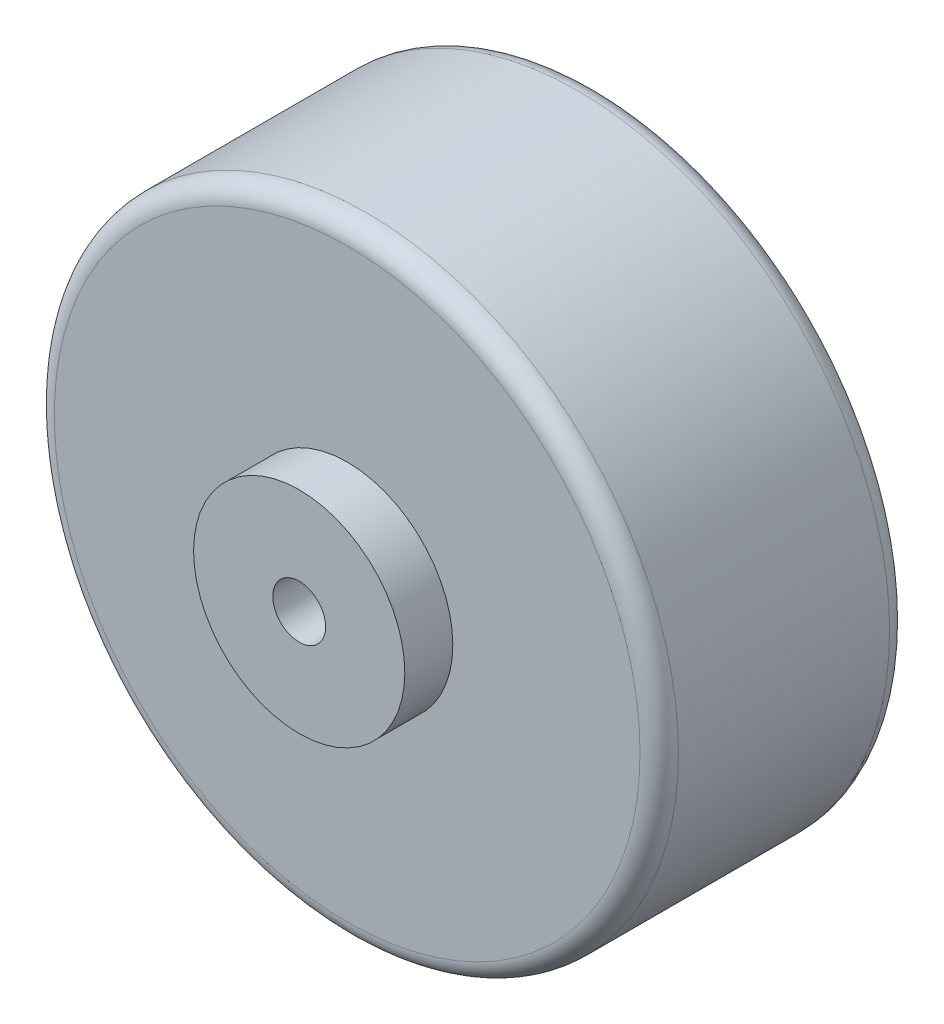
ISO-10303-21;
HEADER;
FILE_DESCRIPTION(('STEP AP214'),'2;1');
FILE_NAME('part.step','',(''),(''),'','','');
FILE_SCHEMA(('AUTOMOTIVE_DESIGN { 1 0 10303 214 1 1 1 1 }'));
ENDSEC;
DATA;
#1=APPLICATION_CONTEXT('core data for automotive mechanical design processes');
#2=APPLICATION_PROTOCOL_DEFINITION('international standard','automotive_design',2000,#1);
#3=PRODUCT_CONTEXT('',#1,'mechanical');
#4=PRODUCT('Part','Part','',(#3));
#5=PRODUCT_RELATED_PRODUCT_CATEGORY('part','',(#4));
#6=PRODUCT_DEFINITION_FORMATION('','',#4);
#7=PRODUCT_DEFINITION_CONTEXT('part definition',#1,'design');
#8=PRODUCT_DEFINITION('design','',#6,#7);
#9=PRODUCT_DEFINITION_SHAPE('','',#8);
#10=(LENGTH_UNIT() NAMED_UNIT(*) SI_UNIT(.MILLI.,.METRE.));
#11=(NAMED_UNIT(*) PLANE_ANGLE_UNIT() SI_UNIT($,.RADIAN.));
#12=(NAMED_UNIT(*) SI_UNIT($,.STERADIAN.) SOLID_ANGLE_UNIT());
#13=UNCERTAINTY_MEASURE_WITH_UNIT(LENGTH_MEASURE(1.E-05),#10,'distance_accuracy_value','');
#14=(GEOMETRIC_REPRESENTATION_CONTEXT(3) GLOBAL_UNCERTAINTY_ASSIGNED_CONTEXT((#13)) GLOBAL_UNIT_ASSIGNED_CONTEXT((#10,
#11,#12)) REPRESENTATION_CONTEXT('',''));
#15=CARTESIAN_POINT('',(0.,0.,0.));
#16=DIRECTION('',(0.,0.,1.));
#17=DIRECTION('',(1.,0.,0.));
#18=AXIS2_PLACEMENT_3D('',#15,#16,#17);
#19=CARTESIAN_POINT('',(0.,0.,26.));
#20=DIRECTION('',(0.,0.,1.));
#21=DIRECTION('',(1.,0.,0.));
#22=AXIS2_PLACEMENT_3D('',#19,#20,#21);
#23=PLANE('',#22);
#24=CARTESIAN_POINT('',(0.,0.,26.));
#25=DIRECTION('',(0.,0.,1.));
#26=DIRECTION('',(1.,0.,0.));
#27=AXIS2_PLACEMENT_3D('',#24,#25,#26);
#28=CIRCLE('',#27,30.5);
#29=CARTESIAN_POINT('',(30.5,0.,26.));
#30=VERTEX_POINT('',#29);
#31=EDGE_CURVE('E10',#30,#30,#28,.T.);
#32=ORIENTED_EDGE('',*,*,#31,.T.);
#33=EDGE_LOOP('',(#32));
#34=FACE_BOUND('',#33,.T.);
#35=CARTESIAN_POINT('',(0.,0.,26.));
#36=DIRECTION('',(0.,0.,1.));
#37=DIRECTION('',(1.,0.,0.));
#38=AXIS2_PLACEMENT_3D('',#35,#36,#37);
#39=CIRCLE('',#38,11.);
#40=CARTESIAN_POINT('',(11.,0.,26.));
#41=VERTEX_POINT('',#40);
#42=EDGE_CURVE('E53',#41,#41,#39,.T.);
#43=ORIENTED_EDGE('',*,*,#42,.F.);
#44=EDGE_LOOP('',(#43));
#45=FACE_BOUND('',#44,.T.);
#46=ADVANCED_FACE('F32',(#34,#45),#23,.T.);
#47=CARTESIAN_POINT('',(0.,0.,26.));
#48=DIRECTION('',(0.,0.,-1.));
#49=DIRECTION('',(-1.,0.,0.));
#50=AXIS2_PLACEMENT_3D('',#47,#48,#49);
#51=CYLINDRICAL_SURFACE('',#50,32.5);
#52=CARTESIAN_POINT('',(0.,0.,2.));
#53=DIRECTION('',(0.,0.,1.));
#54=DIRECTION('',(1.,0.,0.));
#55=AXIS2_PLACEMENT_3D('',#52,#53,#54);
#56=CIRCLE('',#55,32.5);
#57=CARTESIAN_POINT('',(-32.5,0.,1.99999999999999));
#58=VERTEX_POINT('',#57);
#59=EDGE_CURVE('E43',#58,#58,#56,.T.);
#60=CARTESIAN_POINT('',(0.,0.,24.));
#61=DIRECTION('',(0.,0.,1.));
#62=DIRECTION('',(1.,0.,0.));
#63=AXIS2_PLACEMENT_3D('',#60,#61,#62);
#64=CIRCLE('',#63,32.5);
#65=CARTESIAN_POINT('',(-32.5,0.,24.));
#66=VERTEX_POINT('',#65);
#67=EDGE_CURVE('E47',#66,#66,#64,.F.);
#68=CARTESIAN_POINT('',(-32.5,0.,1.99999999999999));
#69=CARTESIAN_POINT('',(-32.5,0.,2.22916666666666));
#70=CARTESIAN_POINT('',(-32.5,0.,2.45833333333333));
#71=CARTESIAN_POINT('',(-32.5,0.,2.91666666666666));
#72=CARTESIAN_POINT('',(-32.5,0.,3.14583333333333));
#73=CARTESIAN_POINT('',(-32.5,0.,3.60416666666666));
#74=CARTESIAN_POINT('',(-32.5,0.,3.83333333333333));
#75=CARTESIAN_POINT('',(-32.5,0.,4.29166666666666));
#76=CARTESIAN_POINT('',(-32.5,0.,4.52083333333333));
#77=CARTESIAN_POINT('',(-32.5,0.,4.97916666666666));
#78=CARTESIAN_POINT('',(-32.5,0.,5.20833333333333));
#79=CARTESIAN_POINT('',(-32.5,0.,5.66666666666666));
#80=CARTESIAN_POINT('',(-32.5,0.,5.89583333333333));
#81=CARTESIAN_POINT('',(-32.5,0.,6.35416666666666));
#82=CARTESIAN_POINT('',(-32.5,0.,6.58333333333333));
#83=CARTESIAN_POINT('',(-32.5,0.,7.04166666666666));
#84=CARTESIAN_POINT('',(-32.5,0.,7.27083333333333));
#85=CARTESIAN_POINT('',(-32.5,0.,7.72916666666666));
#86=CARTESIAN_POINT('',(-32.5,0.,7.95833333333333));
#87=CARTESIAN_POINT('',(-32.5,0.,8.41666666666666));
#88=CARTESIAN_POINT('',(-32.5,0.,8.64583333333333));
#89=CARTESIAN_POINT('',(-32.5,0.,9.10416666666666));
#90=CARTESIAN_POINT('',(-32.5,0.,9.33333333333333));
#91=CARTESIAN_POINT('',(-32.5,0.,9.79166666666666));
#92=CARTESIAN_POINT('',(-32.5,0.,10.0208333333333));
#93=CARTESIAN_POINT('',(-32.5,0.,10.4791666666667));
#94=CARTESIAN_POINT('',(-32.5,0.,10.7083333333333));
#95=CARTESIAN_POINT('',(-32.5,0.,11.1666666666667));
#96=CARTESIAN_POINT('',(-32.5,0.,11.3958333333333));
#97=CARTESIAN_POINT('',(-32.5,0.,11.8541666666667));
#98=CARTESIAN_POINT('',(-32.5,0.,12.0833333333333));
#99=CARTESIAN_POINT('',(-32.5,0.,12.5416666666667));
#100=CARTESIAN_POINT('',(-32.5,0.,12.7708333333333));
#101=CARTESIAN_POINT('',(-32.5,0.,13.2291666666667));
#102=CARTESIAN_POINT('',(-32.5,0.,13.4583333333333));
#103=CARTESIAN_POINT('',(-32.5,0.,13.9166666666667));
#104=CARTESIAN_POINT('',(-32.5,0.,14.1458333333333));
#105=CARTESIAN_POINT('',(-32.5,0.,14.6041666666667));
#106=CARTESIAN_POINT('',(-32.5,0.,14.8333333333333));
#107=CARTESIAN_POINT('',(-32.5,0.,15.2916666666667));
#108=CARTESIAN_POINT('',(-32.5,0.,15.5208333333333));
#109=CARTESIAN_POINT('',(-32.5,0.,15.9791666666667));
#110=CARTESIAN_POINT('',(-32.5,0.,16.2083333333333));
#111=CARTESIAN_POINT('',(-32.5,0.,16.6666666666667));
#112=CARTESIAN_POINT('',(-32.5,0.,16.8958333333333));
#113=CARTESIAN_POINT('',(-32.5,0.,17.3541666666667));
#114=CARTESIAN_POINT('',(-32.5,0.,17.5833333333333));
#115=CARTESIAN_POINT('',(-32.5,0.,18.0416666666667));
#116=CARTESIAN_POINT('',(-32.5,0.,18.2708333333333));
#117=CARTESIAN_POINT('',(-32.5,0.,18.7291666666667));
#118=CARTESIAN_POINT('',(-32.5,0.,18.9583333333333));
#119=CARTESIAN_POINT('',(-32.5,0.,19.4166666666667));
#120=CARTESIAN_POINT('',(-32.5,0.,19.6458333333333));
#121=CARTESIAN_POINT('',(-32.5,0.,20.1041666666667));
#122=CARTESIAN_POINT('',(-32.5,0.,20.3333333333333));
#123=CARTESIAN_POINT('',(-32.5,0.,20.7916666666667));
#124=CARTESIAN_POINT('',(-32.5,0.,21.0208333333333));
#125=CARTESIAN_POINT('',(-32.5,0.,21.4791666666667));
#126=CARTESIAN_POINT('',(-32.5,0.,21.7083333333333));
#127=CARTESIAN_POINT('',(-32.5,0.,22.1666666666667));
#128=CARTESIAN_POINT('',(-32.5,0.,22.3958333333333));
#129=CARTESIAN_POINT('',(-32.5,0.,22.8541666666667));
#130=CARTESIAN_POINT('',(-32.5,0.,23.0833333333333));
#131=CARTESIAN_POINT('',(-32.5,0.,23.5416666666667));
#132=CARTESIAN_POINT('',(-32.5,0.,23.7708333333333));
#133=CARTESIAN_POINT('',(-32.5,0.,24.));
#134=B_SPLINE_CURVE_WITH_KNOTS('',3,(#68,#69,#70,#71,#72,#73,#74,#75,#76,#77,#78,#79,#80,#81,
#82,#83,#84,#85,#86,#87,#88,#89,#90,#91,#92,#93,#94,#95,#96,#97,#98,#99,#100,#101,#102,#103,
#104,#105,#106,#107,#108,#109,#110,#111,#112,#113,#114,#115,#116,#117,#118,#119,#120,#121,#122,
#123,#124,#125,#126,#127,#128,#129,#130,#131,#132,#133),.UNSPECIFIED.,.F.,.F.,(4,2,2,2,2,2,2,2,
2,2,2,2,2,2,2,2,2,2,2,2,2,2,2,2,2,2,2,2,2,2,2,2,4),(0.,0.687500000000001,1.375,2.0625,2.75,
3.4375,4.125,4.8125,5.5,6.1875,6.875,7.5625,8.25,8.9375,9.625,10.3125,11.,11.6875,12.375,
13.0625,13.75,14.4375,15.125,15.8125,16.5,17.1875,17.875,18.5625,19.25,19.9375,20.625,21.3125,
22.),.UNSPECIFIED.);
#135=EDGE_CURVE('BSEAM87',#58,#66,#134,.T.);
#136=ORIENTED_EDGE('',*,*,#59,.T.);
#137=ORIENTED_EDGE('',*,*,#67,.T.);
#138=ORIENTED_EDGE('',*,*,#135,.T.);
#139=ORIENTED_EDGE('',*,*,#135,.F.);
#140=EDGE_LOOP('',(#136,#138,#137,#139));
#141=FACE_BOUND('',#140,.T.);
#142=ADVANCED_FACE('F87',(#141),#51,.T.);
#143=CARTESIAN_POINT('',(0.,0.,0.));
#144=DIRECTION('',(0.,0.,1.));
#145=DIRECTION('',(1.,0.,0.));
#146=AXIS2_PLACEMENT_3D('',#143,#144,#145);
#147=PLANE('',#146);
#148=CARTESIAN_POINT('',(0.,0.,0.));
#149=DIRECTION('',(0.,0.,1.));
#150=DIRECTION('',(1.,0.,0.));
#151=AXIS2_PLACEMENT_3D('',#148,#149,#150);
#152=CIRCLE('',#151,30.5);
#153=CARTESIAN_POINT('',(30.5,0.,0.));
#154=VERTEX_POINT('',#153);
#155=EDGE_CURVE('E39',#154,#154,#152,.F.);
#156=ORIENTED_EDGE('',*,*,#155,.T.);
#157=EDGE_LOOP('',(#156));
#158=FACE_BOUND('',#157,.T.);
#159=CARTESIAN_POINT('',(0.,0.,0.));
#160=DIRECTION('',(0.,0.,1.));
#161=DIRECTION('',(1.,0.,0.));
#162=AXIS2_PLACEMENT_3D('',#159,#160,#161);
#163=CIRCLE('',#162,2.75);
#164=CARTESIAN_POINT('',(2.75,0.,0.));
#165=VERTEX_POINT('',#164);
#166=EDGE_CURVE('E56',#165,#165,#163,.T.);
#167=ORIENTED_EDGE('',*,*,#166,.T.);
#168=EDGE_LOOP('',(#167));
#169=FACE_BOUND('',#168,.T.);
#170=ADVANCED_FACE('F65',(#158,#169),#147,.F.);
#171=CARTESIAN_POINT('',(0.,0.,31.));
#172=DIRECTION('',(0.,0.,-1.));
#173=DIRECTION('',(-1.,0.,0.));
#174=AXIS2_PLACEMENT_3D('',#171,#172,#173);
#175=CYLINDRICAL_SURFACE('',#174,11.);
#176=CARTESIAN_POINT('',(0.,0.,31.));
#177=DIRECTION('',(0.,0.,1.));
#178=DIRECTION('',(1.,0.,0.));
#179=AXIS2_PLACEMENT_3D('',#176,#177,#178);
#180=CIRCLE('',#179,11.);
#181=CARTESIAN_POINT('',(11.,0.,31.));
#182=VERTEX_POINT('',#181);
#183=EDGE_CURVE('E52',#182,#182,#180,.T.);
#184=ORIENTED_EDGE('',*,*,#183,.F.);
#185=EDGE_LOOP('',(#184));
#186=FACE_BOUND('',#185,.T.);
#187=ORIENTED_EDGE('',*,*,#42,.T.);
#188=EDGE_LOOP('',(#187));
#189=FACE_BOUND('',#188,.T.);
#190=ADVANCED_FACE('F77',(#186,#189),#175,.T.);
#191=CARTESIAN_POINT('',(0.,0.,31.));
#192=DIRECTION('',(0.,0.,1.));
#193=DIRECTION('',(1.,0.,0.));
#194=AXIS2_PLACEMENT_3D('',#191,#192,#193);
#195=PLANE('',#194);
#196=CARTESIAN_POINT('',(0.,0.,31.));
#197=DIRECTION('',(0.,0.,1.));
#198=DIRECTION('',(1.,0.,0.));
#199=AXIS2_PLACEMENT_3D('',#196,#197,#198);
#200=CIRCLE('',#199,2.75);
#201=CARTESIAN_POINT('',(2.75,0.,31.));
#202=VERTEX_POINT('',#201);
#203=EDGE_CURVE('E59',#202,#202,#200,.T.);
#204=ORIENTED_EDGE('',*,*,#203,.F.);
#205=EDGE_LOOP('',(#204));
#206=FACE_BOUND('',#205,.T.);
#207=ORIENTED_EDGE('',*,*,#183,.T.);
#208=EDGE_LOOP('',(#207));
#209=FACE_BOUND('',#208,.T.);
#210=ADVANCED_FACE('F71',(#206,#209),#195,.T.);
#211=CARTESIAN_POINT('',(0.,0.,0.));
#212=DIRECTION('',(0.,0.,1.));
#213=DIRECTION('',(1.,0.,0.));
#214=AXIS2_PLACEMENT_3D('',#211,#212,#213);
#215=CYLINDRICAL_SURFACE('',#214,2.75);
#216=ORIENTED_EDGE('',*,*,#166,.F.);
#217=EDGE_LOOP('',(#216));
#218=FACE_BOUND('',#217,.T.);
#219=ORIENTED_EDGE('',*,*,#203,.T.);
#220=EDGE_LOOP('',(#219));
#221=FACE_BOUND('',#220,.T.);
#222=ADVANCED_FACE('F67',(#218,#221),#215,.F.);
#223=CARTESIAN_POINT('',(0.,0.,2.));
#224=DIRECTION('',(0.,0.,1.));
#225=DIRECTION('',(1.,0.,0.));
#226=AXIS2_PLACEMENT_3D('',#223,#224,#225);
#227=TOROIDAL_SURFACE('',#226,30.5,2.);
#228=ORIENTED_EDGE('',*,*,#155,.F.);
#229=EDGE_LOOP('',(#228));
#230=FACE_BOUND('',#229,.T.);
#231=ORIENTED_EDGE('',*,*,#59,.F.);
#232=EDGE_LOOP('',(#231));
#233=FACE_BOUND('',#232,.T.);
#234=ADVANCED_FACE('F70',(#230,#233),#227,.T.);
#235=CARTESIAN_POINT('',(0.,0.,24.));
#236=DIRECTION('',(0.,0.,1.));
#237=DIRECTION('',(1.,0.,0.));
#238=AXIS2_PLACEMENT_3D('',#235,#236,#237);
#239=TOROIDAL_SURFACE('',#238,30.5,2.);
#240=ORIENTED_EDGE('',*,*,#67,.F.);
#241=EDGE_LOOP('',(#240));
#242=FACE_BOUND('',#241,.T.);
#243=ORIENTED_EDGE('',*,*,#31,.F.);
#244=EDGE_LOOP('',(#243));
#245=FACE_BOUND('',#244,.T.);
#246=ADVANCED_FACE('F34',(#242,#245),#239,.T.);
#247=CLOSED_SHELL('',(#46,#142,#170,#190,#210,#222,#234,#246));
#248=MANIFOLD_SOLID_BREP('B2',#247);
#249=ADVANCED_BREP_SHAPE_REPRESENTATION('',(#18,#248),#14);
#250=SHAPE_DEFINITION_REPRESENTATION(#9,#249);
ENDSEC;
END-ISO-10303-21;
